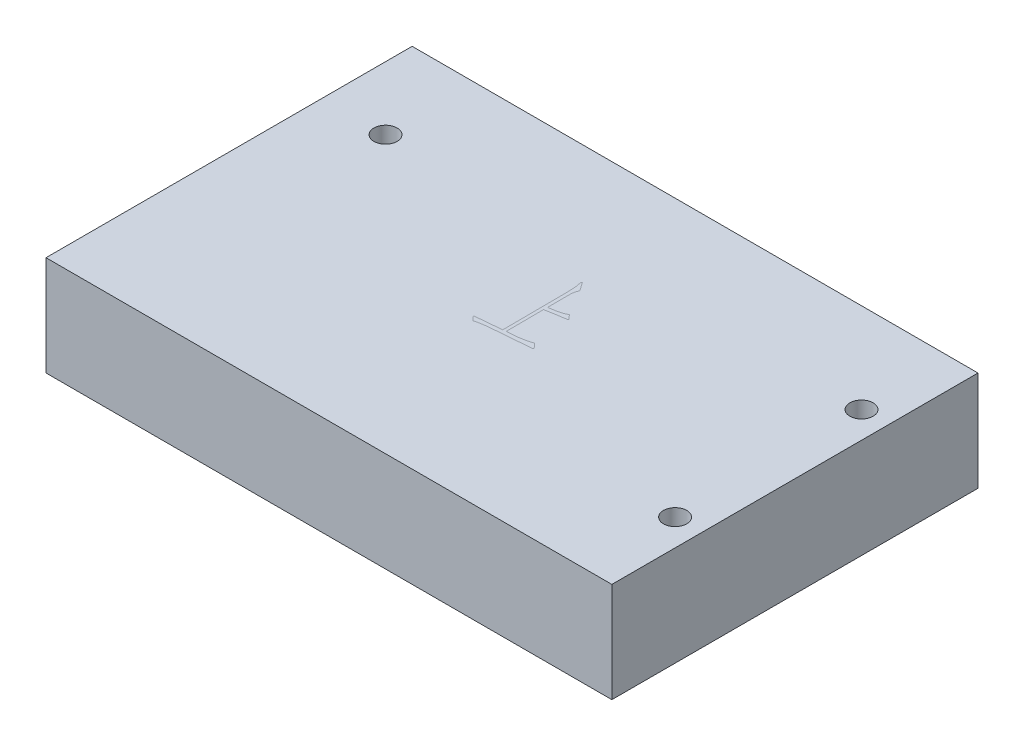
ISO-10303-21;
HEADER;
FILE_DESCRIPTION(('STEP AP214'),'2;1');
FILE_NAME('part.step','',(''),(''),'','','');
FILE_SCHEMA(('AUTOMOTIVE_DESIGN { 1 0 10303 214 1 1 1 1 }'));
ENDSEC;
DATA;
#1=APPLICATION_CONTEXT('core data for automotive mechanical design processes');
#2=APPLICATION_PROTOCOL_DEFINITION('international standard','automotive_design',2000,#1);
#3=PRODUCT_CONTEXT('',#1,'mechanical');
#4=PRODUCT('Part','Part','',(#3));
#5=PRODUCT_RELATED_PRODUCT_CATEGORY('part','',(#4));
#6=PRODUCT_DEFINITION_FORMATION('','',#4);
#7=PRODUCT_DEFINITION_CONTEXT('part definition',#1,'design');
#8=PRODUCT_DEFINITION('design','',#6,#7);
#9=PRODUCT_DEFINITION_SHAPE('','',#8);
#10=(LENGTH_UNIT() NAMED_UNIT(*) SI_UNIT(.MILLI.,.METRE.));
#11=(NAMED_UNIT(*) PLANE_ANGLE_UNIT() SI_UNIT($,.RADIAN.));
#12=(NAMED_UNIT(*) SI_UNIT($,.STERADIAN.) SOLID_ANGLE_UNIT());
#13=UNCERTAINTY_MEASURE_WITH_UNIT(LENGTH_MEASURE(1.E-05),#10,'distance_accuracy_value','');
#14=(GEOMETRIC_REPRESENTATION_CONTEXT(3) GLOBAL_UNCERTAINTY_ASSIGNED_CONTEXT((#13)) GLOBAL_UNIT_ASSIGNED_CONTEXT((#10,
#11,#12)) REPRESENTATION_CONTEXT('',''));
#15=CARTESIAN_POINT('',(0.,0.,0.));
#16=DIRECTION('',(0.,0.,1.));
#17=DIRECTION('',(1.,0.,0.));
#18=AXIS2_PLACEMENT_3D('',#15,#16,#17);
#19=CARTESIAN_POINT('',(0.,15.,0.));
#20=DIRECTION('',(0.,-1.,0.));
#21=DIRECTION('',(0.,0.,-1.));
#22=AXIS2_PLACEMENT_3D('',#19,#20,#21);
#23=PLANE('',#22);
#24=CARTESIAN_POINT('',(43.6304159329871,15.,-34.4012403551576));
#25=CARTESIAN_POINT('',(43.6285832728739,15.,-34.454265991002));
#26=CARTESIAN_POINT('',(43.6267491316268,15.,-34.5072915864593));
#27=CARTESIAN_POINT('',(43.6231058574937,15.,-34.6133444274817));
#28=CARTESIAN_POINT('',(43.6212967249818,15.,-34.6663716730596));
#29=CARTESIAN_POINT('',(43.6177301226751,15.,-34.7724687952729));
#30=CARTESIAN_POINT('',(43.6159726937362,15.,-34.8255386732924));
#31=CARTESIAN_POINT('',(43.6125200089942,15.,-34.9316796062416));
#32=CARTESIAN_POINT('',(43.6108247522266,15.,-34.9847506611404));
#33=CARTESIAN_POINT('',(43.6074169088284,15.,-35.0908928143295));
#34=CARTESIAN_POINT('',(43.6057043220144,15.,-35.1439639126143));
#35=CARTESIAN_POINT('',(43.6022278782611,15.,-35.250104658213));
#36=CARTESIAN_POINT('',(43.6004640209766,15.,-35.3031743055147));
#37=CARTESIAN_POINT('',(43.5967029564214,15.,-35.409272758926));
#38=CARTESIAN_POINT('',(43.5947058970461,15.,-35.4623015696818));
#39=CARTESIAN_POINT('',(43.591188950543,15.,-35.5418185556303));
#40=CARTESIAN_POINT('',(43.5899298459645,15.,-35.5683180363251));
#41=CARTESIAN_POINT('',(43.5872438016238,15.,-35.6213096957998));
#42=CARTESIAN_POINT('',(43.5858168536847,15.,-35.6478018741608));
#43=CARTESIAN_POINT('',(43.5823475773483,15.,-35.7095081415847));
#44=CARTESIAN_POINT('',(43.580257417322,15.,-35.7447195115175));
#45=CARTESIAN_POINT('',(43.5756568296041,15.,-35.8151136980117));
#46=CARTESIAN_POINT('',(43.573146440726,15.,-35.8502965169089));
#47=CARTESIAN_POINT('',(43.567214957844,15.,-35.9205862301696));
#48=CARTESIAN_POINT('',(43.5637938948243,15.,-35.9556931270752));
#49=CARTESIAN_POINT('',(43.5560561340244,15.,-36.0258092508598));
#50=CARTESIAN_POINT('',(43.55173937888,15.,-36.0608184713376));
#51=CARTESIAN_POINT('',(43.5423813749196,15.,-36.130757469123));
#52=CARTESIAN_POINT('',(43.5373397277801,15.,-36.1656871919566));
#53=CARTESIAN_POINT('',(43.5269633465459,15.,-36.235502410041));
#54=CARTESIAN_POINT('',(43.5216286089425,15.,-36.2703879047571));
#55=CARTESIAN_POINT('',(43.5106388816591,15.,-36.3402877146074));
#56=CARTESIAN_POINT('',(43.5049824244971,15.,-36.3753018020442));
#57=CARTESIAN_POINT('',(43.4932361218893,15.,-36.4452560529697));
#58=CARTESIAN_POINT('',(43.4871462916571,15.,-36.4801962190093));
#59=CARTESIAN_POINT('',(43.4746127119021,15.,-36.5500043746615));
#60=CARTESIAN_POINT('',(43.4681690432113,15.,-36.5848723788861));
#61=CARTESIAN_POINT('',(43.4550305554074,15.,-36.6545621690969));
#62=CARTESIAN_POINT('',(43.4483357269324,15.,-36.68938395331));
#63=CARTESIAN_POINT('',(43.4347891314852,15.,-36.7589591534118));
#64=CARTESIAN_POINT('',(43.4279375353422,15.,-36.7937126027313));
#65=CARTESIAN_POINT('',(43.414152703554,15.,-36.8632008299132));
#66=CARTESIAN_POINT('',(43.4072194736149,15.,-36.8979356089052));
#67=CARTESIAN_POINT('',(43.4002859521646,15.,-36.9326701442051));
#68=B_SPLINE_CURVE_WITH_KNOTS('',3,(#24,#25,#26,#27,#28,#29,#30,#31,#32,#33,#34,#35,#36,#37,#38,
#39,#40,#41,#42,#43,#44,#45,#46,#47,#48,#49,#50,#51,#52,#53,#54,#55,#56,#57,#58,#59,#60,#61,#62,
#63,#64,#65,#66,#67),.UNSPECIFIED.,.F.,.F.,(4,2,2,2,2,2,2,2,2,2,2,2,2,2,2,2,2,2,2,2,2,4),(0.,
0.159171907330281,0.318346192832109,0.477643051066184,0.63693743701451,0.796233511283576,
0.955530658156853,1.11472732278019,1.19431478075348,1.27390611771138,1.37972577234889,
1.48553565856637,1.59134194523655,1.69715501031225,1.80302644279269,1.9088991429829,
2.01530104405257,2.12169921172574,2.22807317378165,2.3344511048819,2.44071817130337,
2.54697785331188),.UNSPECIFIED.);
#69=CARTESIAN_POINT('',(43.6304159329871,15.,-34.4012403551575));
#70=VERTEX_POINT('',#69);
#71=CARTESIAN_POINT('',(43.4002859521646,15.,-36.9326701442051));
#72=VERTEX_POINT('',#71);
#73=EDGE_CURVE('E11',#70,#72,#68,.T.);
#74=ORIENTED_EDGE('',*,*,#73,.F.);
#75=DIRECTION('',(-0.00607003205575866,0.,-0.999981577185721));
#76=VECTOR('',#75,1.);
#77=CARTESIAN_POINT('',(43.8376211424196,15.,-0.266100667905875));
#78=LINE('',#77,#76);
#79=CARTESIAN_POINT('',(43.6879484281927,15.,-24.9232944783197));
#80=VERTEX_POINT('',#79);
#81=EDGE_CURVE('E172',#80,#70,#78,.T.);
#82=ORIENTED_EDGE('',*,*,#81,.F.);
#83=DIRECTION('',(0.995730377013171,0.,-0.0923093510604914));
#84=VECTOR('',#83,1.);
#85=CARTESIAN_POINT('',(-1.91856449768023,15.,-20.6953350733376));
#86=LINE('',#85,#84);
#87=CARTESIAN_POINT('',(40.8837719952074,15.,-24.6633328333165));
#88=VERTEX_POINT('',#87);
#89=EDGE_CURVE('E175',#88,#80,#86,.T.);
#90=ORIENTED_EDGE('',*,*,#89,.F.);
#91=DIRECTION('',(0.996815278536125,0.,-0.0797452222828909));
#92=VECTOR('',#91,1.);
#93=CARTESIAN_POINT('',(-1.7005271123768,15.,-21.2565889047097));
#94=LINE('',#93,#92);
#95=CARTESIAN_POINT('',(39.8183554173254,15.,-24.578099507086));
#96=VERTEX_POINT('',#95);
#97=EDGE_CURVE('E183',#96,#88,#94,.T.);
#98=ORIENTED_EDGE('',*,*,#97,.F.);
#99=CARTESIAN_POINT('',(39.7608229221198,15.,-24.3756703572884));
#100=CARTESIAN_POINT('',(39.748901573268,15.,-24.3920615223878));
#101=CARTESIAN_POINT('',(39.7241693136792,15.,-24.4260669487235));
#102=CARTESIAN_POINT('',(39.7115870829383,15.,-24.489907431768));
#103=CARTESIAN_POINT('',(39.7403496147427,15.,-24.5618128840292));
#104=CARTESIAN_POINT('',(39.7903341662888,15.,-24.5722490249666));
#105=CARTESIAN_POINT('',(39.8183554173254,15.,-24.578099507086));
#106=B_SPLINE_CURVE_WITH_KNOTS('',3,(#99,#100,#101,#102,#103,#104,#105),.UNSPECIFIED.,.F.,.F.,
(4,1,1,1,4),(0.,0.224692634421683,0.466151660461418,0.700725566700259,1.),.UNSPECIFIED.);
#107=CARTESIAN_POINT('',(39.7608229221198,15.,-24.3756703572884));
#108=VERTEX_POINT('',#107);
#109=EDGE_CURVE('E186',#108,#96,#106,.T.);
#110=ORIENTED_EDGE('',*,*,#109,.F.);
#111=DIRECTION('',(-0.707106781186548,0.,-0.707106781186548));
#112=VECTOR('',#111,1.);
#113=CARTESIAN_POINT('',(32.0682466397041,15.,-32.0682466397041));
#114=LINE('',#113,#112);
#115=CARTESIAN_POINT('',(40.2786153789704,15.,-23.8578779004378));
#116=VERTEX_POINT('',#115);
#117=EDGE_CURVE('E191',#116,#108,#114,.T.);
#118=ORIENTED_EDGE('',*,*,#117,.F.);
#119=CARTESIAN_POINT('',(45.9466315733024,15.,-24.5333520108149));
#120=CARTESIAN_POINT('',(45.7989234739823,15.,-24.5209043032944));
#121=CARTESIAN_POINT('',(45.5106743377525,15.,-24.4966128733907));
#122=CARTESIAN_POINT('',(45.0890925540405,15.,-24.4673519953322));
#123=CARTESIAN_POINT('',(44.6910188013324,15.,-24.4305673951137));
#124=CARTESIAN_POINT('',(44.3150091412477,15.,-24.4026346818154));
#125=CARTESIAN_POINT('',(43.9614526526095,15.,-24.3715558889798));
#126=CARTESIAN_POINT('',(43.6295932885963,15.,-24.3450111077905));
#127=CARTESIAN_POINT('',(43.32074403826,15.,-24.3166068168085));
#128=CARTESIAN_POINT('',(43.0352184347987,15.,-24.2909856071705));
#129=CARTESIAN_POINT('',(42.7722876565145,15.,-24.2682070056812));
#130=CARTESIAN_POINT('',(42.5316256712335,15.,-24.2441632726846));
#131=CARTESIAN_POINT('',(42.3128621127058,15.,-24.2228595011967));
#132=CARTESIAN_POINT('',(42.1166625830201,15.,-24.2045287610733));
#133=CARTESIAN_POINT('',(41.9434986501802,15.,-24.1846535359173));
#134=CARTESIAN_POINT('',(41.7929214462582,15.,-24.1676467997352));
#135=CARTESIAN_POINT('',(41.6641654961637,15.,-24.1534986614887));
#136=CARTESIAN_POINT('',(41.4652038105082,15.,-24.1246907982284));
#137=CARTESIAN_POINT('',(41.1970988909247,15.,-24.0840005785148));
#138=CARTESIAN_POINT('',(40.8642580798744,15.,-24.0163387885662));
#139=CARTESIAN_POINT('',(40.5592117352288,15.,-23.9476982122806));
#140=CARTESIAN_POINT('',(40.3691748971667,15.,-23.8868664599229));
#141=CARTESIAN_POINT('',(40.2786153789704,15.,-23.8578779004378));
#142=B_SPLINE_CURVE_WITH_KNOTS('',3,(#119,#120,#121,#122,#123,#124,#125,#126,#127,#128,#129,
#130,#131,#132,#133,#134,#135,#136,#137,#138,#139,#140,#141),.UNSPECIFIED.,.F.,.F.,(4,1,1,1,1,1,
1,1,1,1,1,1,1,1,1,1,1,1,1,1,4),(0.,0.0777687064644551,0.151763935540928,0.221703244772091,
0.287496014786442,0.34957476730516,0.40790895989643,0.462159279704267,0.512293599289809,
0.558311919269334,0.600619899854703,0.639182854090695,0.673629891067738,0.703999924733564,
0.730625175752077,0.753135552795725,0.771949536150035,0.836093284444404,0.895362659511708,
0.950136472293573,1.),.UNSPECIFIED.);
#143=CARTESIAN_POINT('',(45.9466315733024,15.,-24.5333520108149));
#144=VERTEX_POINT('',#143);
#145=EDGE_CURVE('E197',#144,#116,#142,.T.);
#146=ORIENTED_EDGE('',*,*,#145,.F.);
#147=DIRECTION('',(-0.997007488789346,0.,0.07730502763703));
#148=VECTOR('',#147,1.);
#149=CARTESIAN_POINT('',(-1.61629584133697,15.,-20.8454625419489));
#150=LINE('',#149,#148);
#151=CARTESIAN_POINT('',(47.8153722509074,15.,-24.6782486654069));
#152=VERTEX_POINT('',#151);
#153=EDGE_CURVE('E202',#152,#144,#150,.T.);
#154=ORIENTED_EDGE('',*,*,#153,.F.);
#155=DIRECTION('',(-0.996428304896931,0.,0.0844430766861855));
#156=VECTOR('',#155,1.);
#157=CARTESIAN_POINT('',(-1.73551028237952,15.,-20.4790213320772));
#158=LINE('',#157,#156);
#159=CARTESIAN_POINT('',(48.3182488756676,15.,-24.7208653285221));
#160=VERTEX_POINT('',#159);
#161=EDGE_CURVE('E208',#160,#152,#158,.T.);
#162=ORIENTED_EDGE('',*,*,#161,.F.);
#163=CARTESIAN_POINT('',(48.3757813708733,15.,-24.965911141435));
#164=CARTESIAN_POINT('',(48.3961522408188,15.,-24.9357607726857));
#165=CARTESIAN_POINT('',(48.4316116113826,15.,-24.883278325889));
#166=CARTESIAN_POINT('',(48.4529349168912,15.,-24.8098739722251));
#167=CARTESIAN_POINT('',(48.4433159006632,15.,-24.7597123646048));
#168=CARTESIAN_POINT('',(48.4137218629214,15.,-24.7360453760989));
#169=CARTESIAN_POINT('',(48.3714471929941,15.,-24.7216230071347));
#170=CARTESIAN_POINT('',(48.3376085456291,15.,-24.7211410591958));
#171=CARTESIAN_POINT('',(48.3182488756676,15.,-24.7208653285221));
#172=B_SPLINE_CURVE_WITH_KNOTS('',3,(#163,#164,#165,#166,#167,#168,#169,#170,#171),
.UNSPECIFIED.,.F.,.F.,(4,1,1,1,1,1,4),(0.,0.306630329437179,0.533748362572841,0.62688853650092,
0.716080281366152,0.837564664183912,1.),.UNSPECIFIED.);
#173=CARTESIAN_POINT('',(48.3757813708733,15.,-24.965911141435));
#174=VERTEX_POINT('',#173);
#175=EDGE_CURVE('E211',#174,#160,#172,.T.);
#176=ORIENTED_EDGE('',*,*,#175,.F.);
#177=DIRECTION('',(0.68940564383784,0.,0.724375495336869));
#178=VECTOR('',#177,1.);
#179=CARTESIAN_POINT('',(37.8514234261582,15.,-36.0241133297226));
#180=LINE('',#179,#178);
#181=CARTESIAN_POINT('',(47.7876714198825,15.,-25.5838527566065));
#182=VERTEX_POINT('',#181);
#183=EDGE_CURVE('E216',#182,#174,#180,.T.);
#184=ORIENTED_EDGE('',*,*,#183,.F.);
#185=CARTESIAN_POINT('',(44.1482083898377,15.,-24.965911141435));
#186=CARTESIAN_POINT('',(44.3521337590722,15.,-24.978360251411));
#187=CARTESIAN_POINT('',(44.7447102713893,15.,-25.0023260198399));
#188=CARTESIAN_POINT('',(45.3109857616784,15.,-25.0537835941935));
#189=CARTESIAN_POINT('',(45.8326467827162,15.,-25.1147451209188));
#190=CARTESIAN_POINT('',(46.310420827893,15.,-25.1862771523202));
#191=CARTESIAN_POINT('',(46.7432060287902,15.,-25.2694026399312));
#192=CARTESIAN_POINT('',(47.1328667835992,15.,-25.3595741839896));
#193=CARTESIAN_POINT('',(47.4779037328531,15.,-25.4616860185862));
#194=CARTESIAN_POINT('',(47.6887234205469,15.,-25.5448294665133));
#195=CARTESIAN_POINT('',(47.7876714198824,15.,-25.5838527566065));
#196=B_SPLINE_CURVE_WITH_KNOTS('',3,(#185,#186,#187,#188,#189,#190,#191,#192,#193,#194,#195),
.UNSPECIFIED.,.F.,.F.,(4,1,1,1,1,1,1,1,4),(0.,0.165336213949227,0.318288570350859,
0.460104121495084,0.590339977561362,0.709163636832215,0.816662264541468,0.913950626126181,1.),.UNSPECIFIED.);
#197=CARTESIAN_POINT('',(44.1482083898377,15.,-24.965911141435));
#198=VERTEX_POINT('',#197);
#199=EDGE_CURVE('E222',#198,#182,#196,.T.);
#200=ORIENTED_EDGE('',*,*,#199,.F.);
#201=DIRECTION('',(0.005276971380947,0.,0.999986076689593));
#202=VECTOR('',#201,1.);
#203=CARTESIAN_POINT('',(44.278721584252,15.,-0.233660799916865));
#204=LINE('',#203,#202);
#205=CARTESIAN_POINT('',(44.118376725657,15.,-30.6190115036766));
#206=VERTEX_POINT('',#205);
#207=EDGE_CURVE('E227',#206,#198,#204,.T.);
#208=ORIENTED_EDGE('',*,*,#207,.F.);
#209=DIRECTION('',(-0.984234677595054,0.,0.176867462862337));
#210=VECTOR('',#209,1.);
#211=CARTESIAN_POINT('',(-3.95001422110567,15.,-21.9810976563384));
#212=LINE('',#211,#210);
#213=CARTESIAN_POINT('',(45.3990074522711,15.,-30.8491414844991));
#214=VERTEX_POINT('',#213);
#215=EDGE_CURVE('E233',#214,#206,#212,.T.);
#216=ORIENTED_EDGE('',*,*,#215,.F.);
#217=DIRECTION('',(-0.98848801526015,0.,0.151299186009211));
#218=VECTOR('',#217,1.);
#219=CARTESIAN_POINT('',(-3.5744695600217,15.,-23.3532011254745));
#220=LINE('',#219,#218);
#221=CARTESIAN_POINT('',(46.2342940493306,15.,-30.976991473845));
#222=VERTEX_POINT('',#221);
#223=EDGE_CURVE('E236',#222,#214,#220,.T.);
#224=ORIENTED_EDGE('',*,*,#223,.F.);
#225=DIRECTION('',(-0.987440631916706,0.,0.157990501106672));
#226=VECTOR('',#225,1.);
#227=CARTESIAN_POINT('',(-3.6785498324418,15.,-22.9909364527614));
#228=LINE('',#227,#226);
#229=CARTESIAN_POINT('',(47.1398981405302,15.,-31.1218881284369));
#230=VERTEX_POINT('',#229);
#231=EDGE_CURVE('E239',#230,#222,#228,.T.);
#232=ORIENTED_EDGE('',*,*,#231,.F.);
#233=CARTESIAN_POINT('',(47.2251314667608,15.,-31.3669339413497));
#234=CARTESIAN_POINT('',(47.2384555144193,15.,-31.3425597508229));
#235=CARTESIAN_POINT('',(47.2643379641105,15.,-31.2952119946275));
#236=CARTESIAN_POINT('',(47.2787588180918,15.,-31.2302988376479));
#237=CARTESIAN_POINT('',(47.2741712805605,15.,-31.1781596990134));
#238=CARTESIAN_POINT('',(47.2434293159228,15.,-31.1487139355597));
#239=CARTESIAN_POINT('',(47.1982050937125,15.,-31.1285809230862));
#240=CARTESIAN_POINT('',(47.1607937930186,15.,-31.1242866470275));
#241=CARTESIAN_POINT('',(47.1398981405302,15.,-31.1218881284369));
#242=B_SPLINE_CURVE_WITH_KNOTS('',3,(#233,#234,#235,#236,#237,#238,#239,#240,#241),
.UNSPECIFIED.,.F.,.F.,(4,1,1,1,1,1,4),(0.,0.240463439428795,0.467109022202763,0.573791783748756,
0.674394348810988,0.818136701763056,1.),.UNSPECIFIED.);
#243=CARTESIAN_POINT('',(47.2251314667608,15.,-31.3669339413497));
#244=VERTEX_POINT('',#243);
#245=EDGE_CURVE('E242',#244,#230,#242,.T.);
#246=ORIENTED_EDGE('',*,*,#245,.F.);
#247=DIRECTION('',(0.698431593965948,0.,0.715676818508316));
#248=VECTOR('',#247,1.);
#249=CARTESIAN_POINT('',(39.8671990752572,15.,-38.9065436758534));
#250=LINE('',#249,#248);
#251=CARTESIAN_POINT('',(46.7073390099101,15.,-31.897511397135));
#252=VERTEX_POINT('',#251);
#253=EDGE_CURVE('E247',#252,#244,#250,.T.);
#254=ORIENTED_EDGE('',*,*,#253,.F.);
#255=CARTESIAN_POINT('',(44.1332925577473,15.,-31.1943364557329));
#256=CARTESIAN_POINT('',(44.2320399778488,15.,-31.2105585998778));
#257=CARTESIAN_POINT('',(44.4218158795591,15.,-31.2417348273643));
#258=CARTESIAN_POINT('',(44.6939164692239,15.,-31.2883014252905));
#259=CARTESIAN_POINT('',(44.9417597965972,15.,-31.3333245331221));
#260=CARTESIAN_POINT('',(45.1649481808547,15.,-31.375206493182));
#261=CARTESIAN_POINT('',(45.3627962413193,15.,-31.4165785552385));
#262=CARTESIAN_POINT('',(45.5367024286971,15.,-31.451544390833));
#263=CARTESIAN_POINT('',(45.6850901784033,15.,-31.4877225531246));
#264=CARTESIAN_POINT('',(45.9274064839186,15.,-31.5545197183475));
#265=CARTESIAN_POINT('',(46.2733892952414,15.,-31.6749856139089));
#266=CARTESIAN_POINT('',(46.5604936868568,15.,-31.8222103439923));
#267=CARTESIAN_POINT('',(46.7073390099101,15.,-31.897511397135));
#268=B_SPLINE_CURVE_WITH_KNOTS('',3,(#255,#256,#257,#258,#259,#260,#261,#262,#263,#264,#265,
#266,#267),.UNSPECIFIED.,.F.,.F.,(4,1,1,1,1,1,1,1,1,1,4),(0.,0.111882670722389,
0.215019640009733,0.308634134817035,0.393515171197862,0.468893232733022,0.534617818096033,
0.591821555528924,0.6396005333735,0.815666434751392,1.),.UNSPECIFIED.);
#269=CARTESIAN_POINT('',(44.1332925577473,15.,-31.1943364557329));
#270=VERTEX_POINT('',#269);
#271=EDGE_CURVE('E253',#270,#252,#268,.T.);
#272=ORIENTED_EDGE('',*,*,#271,.F.);
#273=DIRECTION('',(0.0051621731056553,0.,0.999986675895648));
#274=VECTOR('',#273,1.);
#275=CARTESIAN_POINT('',(44.293144911504,15.,-0.228651928009208));
#276=LINE('',#275,#274);
#277=CARTESIAN_POINT('',(44.118376725657,15.,-34.0837462149487));
#278=VERTEX_POINT('',#277);
#279=EDGE_CURVE('E258',#278,#270,#276,.T.);
#280=ORIENTED_EDGE('',*,*,#279,.F.);
#281=CARTESIAN_POINT('',(44.3932542027505,15.,-35.8097210711175));
#282=CARTESIAN_POINT('',(44.3865773370288,15.,-35.7925141899272));
#283=CARTESIAN_POINT('',(44.3798991355433,15.,-35.7753079192716));
#284=CARTESIAN_POINT('',(44.3665480475525,15.,-35.7408945348499));
#285=CARTESIAN_POINT('',(44.3598751607453,15.,-35.7236874212009));
#286=CARTESIAN_POINT('',(44.3465417566697,15.,-35.6892678899998));
#287=CARTESIAN_POINT('',(44.3398812396037,15.,-35.6720554723661));
#288=CARTESIAN_POINT('',(44.3265637960313,15.,-35.6376287398742));
#289=CARTESIAN_POINT('',(44.3199068697831,15.,-35.6204144249652));
#290=CARTESIAN_POINT('',(44.3001280480527,15.,-35.5687844202713));
#291=CARTESIAN_POINT('',(44.2871666301974,15.,-35.5343024992451));
#292=CARTESIAN_POINT('',(44.2690028713287,15.,-35.4821258075076));
#293=CARTESIAN_POINT('',(44.2631607207397,15.,-35.4646558138346));
#294=CARTESIAN_POINT('',(44.2518144230123,15.,-35.4296055766873));
#295=CARTESIAN_POINT('',(44.2463103154199,15.,-35.412025320578));
#296=CARTESIAN_POINT('',(44.2367477927008,15.,-35.3809141484112));
#297=CARTESIAN_POINT('',(44.2326515101328,15.,-35.3673947665751));
#298=CARTESIAN_POINT('',(44.2245126771684,15.,-35.3403397895386));
#299=CARTESIAN_POINT('',(44.2204701266743,15.,-35.3268041943678));
#300=CARTESIAN_POINT('',(44.2125625333513,15.,-35.2996818579289));
#301=CARTESIAN_POINT('',(44.2086974747907,15.,-35.2860951213096));
#302=CARTESIAN_POINT('',(44.2012784738465,15.,-35.2588376173188));
#303=CARTESIAN_POINT('',(44.1977245002964,15.,-35.2451668585124));
#304=CARTESIAN_POINT('',(44.1876517822669,15.,-35.2040220626567));
#305=CARTESIAN_POINT('',(44.1817185635644,15.,-35.1764034933408));
#306=CARTESIAN_POINT('',(44.1710779897924,15.,-35.1209028673955));
#307=CARTESIAN_POINT('',(44.1663721980856,15.,-35.0930205211591));
#308=CARTESIAN_POINT('',(44.1578786304836,15.,-35.037097248308));
#309=CARTESIAN_POINT('',(44.1540915427901,15.,-35.0090562188154));
#310=CARTESIAN_POINT('',(44.1472624472577,15.,-34.952877981932));
#311=CARTESIAN_POINT('',(44.144220617542,15.,-34.924740753175));
#312=CARTESIAN_POINT('',(44.1372220941132,15.,-34.8514950571563));
#313=CARTESIAN_POINT('',(44.1338116760044,15.,-34.8063340798668));
#314=CARTESIAN_POINT('',(44.1283923721589,15.,-34.715945660636));
#315=CARTESIAN_POINT('',(44.1263831563481,15.,-34.6707182368644));
#316=CARTESIAN_POINT('',(44.1239283801625,15.,-34.6028575002665));
#317=CARTESIAN_POINT('',(44.1232032745421,15.,-34.5802328966333));
#318=CARTESIAN_POINT('',(44.1218690839214,15.,-34.5349802366414));
#319=CARTESIAN_POINT('',(44.1212599990494,15.,-34.512352180279));
#320=CARTESIAN_POINT('',(44.1196519345141,15.,-34.4446084067047));
#321=CARTESIAN_POINT('',(44.1188668108969,15.,-34.399486704121));
#322=CARTESIAN_POINT('',(44.1183623078111,15.,-34.3318041776347));
#323=CARTESIAN_POINT('',(44.1183063082361,15.,-34.3092456675643));
#324=CARTESIAN_POINT('',(44.1183059892417,15.,-34.2641283491849));
#325=CARTESIAN_POINT('',(44.1183616724948,15.,-34.2415695408816));
#326=CARTESIAN_POINT('',(44.1184034125421,15.,-34.1964663152965));
#327=CARTESIAN_POINT('',(44.1183895139829,15.,-34.1739218980672));
#328=CARTESIAN_POINT('',(44.1183637287783,15.,-34.1288337119494));
#329=CARTESIAN_POINT('',(44.1183518420751,15.,-34.106289943061));
#330=CARTESIAN_POINT('',(44.118376725657,15.,-34.0837462149487));
#331=B_SPLINE_CURVE_WITH_KNOTS('',3,(#281,#282,#283,#284,#285,#286,#287,#288,#289,#290,#291,
#292,#293,#294,#295,#296,#297,#298,#299,#300,#301,#302,#303,#304,#305,#306,#307,#308,#309,#310,
#311,#312,#313,#314,#315,#316,#317,#318,#319,#320,#321,#322,#323,#324,#325,#326,#327,#328,#329,
#330),.UNSPECIFIED.,.F.,.F.,(4,2,2,2,2,2,2,2,2,2,2,2,2,2,2,2,2,2,2,2,2,2,2,2,4),(0.,
0.0553705389687148,0.110737669960339,0.166105699405278,0.221477288732297,0.331964816787578,
0.387221871707687,0.44248537861677,0.484864277821327,0.527243100012757,0.569618158757411,
0.611988967217668,0.696692953676146,0.781504305757566,0.866378995226625,0.951273950755734,
1.08711007876135,1.2229141977194,1.29082280569715,1.35873148871591,1.49410943653167,
1.56178444681699,1.62946107656713,1.69709428769228,1.76472555353863),.UNSPECIFIED.);
#332=CARTESIAN_POINT('',(44.3932542027505,15.,-35.8097210711175));
#333=VERTEX_POINT('',#332);
#334=EDGE_CURVE('E264',#333,#278,#331,.T.);
#335=ORIENTED_EDGE('',*,*,#334,.F.);
#336=DIRECTION('',(0.576413111940898,0.,0.817158445090431));
#337=VECTOR('',#336,1.);
#338=CARTESIAN_POINT('',(46.5106283313262,15.,-32.8080021394374));
#339=LINE('',#338,#337);
#340=CARTESIAN_POINT('',(43.5004351104854,15.,-37.0754359656412));
#341=VERTEX_POINT('',#340);
#342=EDGE_CURVE('E271',#341,#333,#339,.T.);
#343=ORIENTED_EDGE('',*,*,#342,.F.);
#344=DIRECTION('',(0.574282108619682,0.,-0.818657473989783));
#345=VECTOR('',#344,1.);
#346=CARTESIAN_POINT('',(11.723336123495,15.,8.22383280304853));
#347=LINE('',#346,#345);
#348=EDGE_CURVE('E48',#72,#341,#347,.T.);
#349=ORIENTED_EDGE('',*,*,#348,.F.);
#350=EDGE_LOOP('',(#74,#82,#90,#98,#110,#118,#146,#154,#162,#176,#184,#200,#208,#216,#224,#232,
#246,#254,#272,#280,#335,#343,#349));
#351=FACE_BOUND('',#350,.T.);
#352=ADVANCED_FACE('F36',(#351),#23,.F.);
#353=ORIENTED_EDGE('',*,*,#81,.T.);
#354=ORIENTED_EDGE('',*,*,#73,.T.);
#355=ORIENTED_EDGE('',*,*,#348,.T.);
#356=ORIENTED_EDGE('',*,*,#342,.T.);
#357=ORIENTED_EDGE('',*,*,#334,.T.);
#358=ORIENTED_EDGE('',*,*,#279,.T.);
#359=ORIENTED_EDGE('',*,*,#271,.T.);
#360=ORIENTED_EDGE('',*,*,#253,.T.);
#361=ORIENTED_EDGE('',*,*,#245,.T.);
#362=ORIENTED_EDGE('',*,*,#231,.T.);
#363=ORIENTED_EDGE('',*,*,#223,.T.);
#364=ORIENTED_EDGE('',*,*,#215,.T.);
#365=ORIENTED_EDGE('',*,*,#207,.T.);
#366=ORIENTED_EDGE('',*,*,#199,.T.);
#367=ORIENTED_EDGE('',*,*,#183,.T.);
#368=ORIENTED_EDGE('',*,*,#175,.T.);
#369=ORIENTED_EDGE('',*,*,#161,.T.);
#370=ORIENTED_EDGE('',*,*,#153,.T.);
#371=ORIENTED_EDGE('',*,*,#145,.T.);
#372=ORIENTED_EDGE('',*,*,#117,.T.);
#373=ORIENTED_EDGE('',*,*,#109,.T.);
#374=ORIENTED_EDGE('',*,*,#97,.T.);
#375=ORIENTED_EDGE('',*,*,#89,.T.);
#376=EDGE_LOOP('',(#353,#354,#355,#356,#357,#358,#359,#360,#361,#362,#363,#364,#365,#366,#367,
#368,#369,#370,#371,#372,#373,#374,#375));
#377=FACE_BOUND('',#376,.T.);
#378=DIRECTION('',(0.,0.,1.));
#379=VECTOR('',#378,1.);
#380=CARTESIAN_POINT('',(0.,15.,0.));
#381=LINE('',#380,#379);
#382=CARTESIAN_POINT('',(0.,15.,-55.));
#383=VERTEX_POINT('',#382);
#384=CARTESIAN_POINT('',(0.,15.,0.));
#385=VERTEX_POINT('',#384);
#386=EDGE_CURVE('E157',#383,#385,#381,.T.);
#387=ORIENTED_EDGE('',*,*,#386,.T.);
#388=DIRECTION('',(1.,0.,0.));
#389=VECTOR('',#388,1.);
#390=CARTESIAN_POINT('',(0.,15.,0.));
#391=LINE('',#390,#389);
#392=CARTESIAN_POINT('',(85.,15.,0.));
#393=VERTEX_POINT('',#392);
#394=EDGE_CURVE('E146',#385,#393,#391,.T.);
#395=ORIENTED_EDGE('',*,*,#394,.T.);
#396=DIRECTION('',(0.,0.,-1.));
#397=VECTOR('',#396,1.);
#398=CARTESIAN_POINT('',(85.,15.,0.));
#399=LINE('',#398,#397);
#400=CARTESIAN_POINT('',(85.,15.,-55.));
#401=VERTEX_POINT('',#400);
#402=EDGE_CURVE('E156',#393,#401,#399,.T.);
#403=ORIENTED_EDGE('',*,*,#402,.T.);
#404=DIRECTION('',(-1.,0.,0.));
#405=VECTOR('',#404,1.);
#406=CARTESIAN_POINT('',(0.,15.,-55.));
#407=LINE('',#406,#405);
#408=EDGE_CURVE('E163',#401,#383,#407,.T.);
#409=ORIENTED_EDGE('',*,*,#408,.T.);
#410=EDGE_LOOP('',(#387,#395,#403,#409));
#411=FACE_BOUND('',#410,.T.);
#412=CARTESIAN_POINT('',(81.,15.,-41.5));
#413=DIRECTION('',(0.,1.,0.));
#414=DIRECTION('',(0.,0.,1.));
#415=AXIS2_PLACEMENT_3D('',#412,#413,#414);
#416=CIRCLE('',#415,1.75);
#417=CARTESIAN_POINT('',(81.,15.,-39.75));
#418=VERTEX_POINT('',#417);
#419=EDGE_CURVE('E456',#418,#418,#416,.T.);
#420=ORIENTED_EDGE('',*,*,#419,.F.);
#421=EDGE_LOOP('',(#420));
#422=FACE_BOUND('',#421,.T.);
#423=CARTESIAN_POINT('',(81.,15.,-13.5));
#424=DIRECTION('',(0.,1.,0.));
#425=DIRECTION('',(0.,0.,1.));
#426=AXIS2_PLACEMENT_3D('',#423,#424,#425);
#427=CIRCLE('',#426,1.75);
#428=CARTESIAN_POINT('',(81.,15.,-11.75));
#429=VERTEX_POINT('',#428);
#430=EDGE_CURVE('E450',#429,#429,#427,.T.);
#431=ORIENTED_EDGE('',*,*,#430,.F.);
#432=EDGE_LOOP('',(#431));
#433=FACE_BOUND('',#432,.T.);
#434=CARTESIAN_POINT('',(9.5,15.,-41.5));
#435=DIRECTION('',(0.,1.,0.));
#436=DIRECTION('',(0.,0.,1.));
#437=AXIS2_PLACEMENT_3D('',#434,#435,#436);
#438=CIRCLE('',#437,1.75);
#439=CARTESIAN_POINT('',(9.5,15.,-39.75));
#440=VERTEX_POINT('',#439);
#441=EDGE_CURVE('E441',#440,#440,#438,.T.);
#442=ORIENTED_EDGE('',*,*,#441,.F.);
#443=EDGE_LOOP('',(#442));
#444=FACE_BOUND('',#443,.T.);
#445=ADVANCED_FACE('F160',(#377,#411,#422,#433,#444),#23,.F.);
#446=CARTESIAN_POINT('',(0.,0.,0.));
#447=DIRECTION('',(0.,-1.,0.));
#448=DIRECTION('',(0.,0.,-1.));
#449=AXIS2_PLACEMENT_3D('',#446,#447,#448);
#450=PLANE('',#449);
#451=CARTESIAN_POINT('',(81.,0.,-13.5));
#452=DIRECTION('',(0.,1.,0.));
#453=DIRECTION('',(0.,0.,1.));
#454=AXIS2_PLACEMENT_3D('',#451,#452,#453);
#455=CIRCLE('',#454,1.75);
#456=CARTESIAN_POINT('',(81.,0.,-11.75));
#457=VERTEX_POINT('',#456);
#458=EDGE_CURVE('E447',#457,#457,#455,.T.);
#459=ORIENTED_EDGE('',*,*,#458,.T.);
#460=EDGE_LOOP('',(#459));
#461=FACE_BOUND('',#460,.T.);
#462=DIRECTION('',(0.,0.,1.));
#463=VECTOR('',#462,1.);
#464=CARTESIAN_POINT('',(0.,0.,0.));
#465=LINE('',#464,#463);
#466=CARTESIAN_POINT('',(0.,0.,-55.));
#467=VERTEX_POINT('',#466);
#468=CARTESIAN_POINT('',(0.,0.,0.));
#469=VERTEX_POINT('',#468);
#470=EDGE_CURVE('E171',#467,#469,#465,.T.);
#471=ORIENTED_EDGE('',*,*,#470,.F.);
#472=DIRECTION('',(-1.,0.,0.));
#473=VECTOR('',#472,1.);
#474=CARTESIAN_POINT('',(0.,0.,-55.));
#475=LINE('',#474,#473);
#476=CARTESIAN_POINT('',(85.,0.,-55.));
#477=VERTEX_POINT('',#476);
#478=EDGE_CURVE('E167',#477,#467,#475,.T.);
#479=ORIENTED_EDGE('',*,*,#478,.F.);
#480=DIRECTION('',(0.,0.,-1.));
#481=VECTOR('',#480,1.);
#482=CARTESIAN_POINT('',(85.,0.,0.));
#483=LINE('',#482,#481);
#484=CARTESIAN_POINT('',(85.,0.,0.));
#485=VERTEX_POINT('',#484);
#486=EDGE_CURVE('E467',#485,#477,#483,.T.);
#487=ORIENTED_EDGE('',*,*,#486,.F.);
#488=DIRECTION('',(1.,0.,0.));
#489=VECTOR('',#488,1.);
#490=CARTESIAN_POINT('',(0.,0.,0.));
#491=LINE('',#490,#489);
#492=EDGE_CURVE('E465',#469,#485,#491,.T.);
#493=ORIENTED_EDGE('',*,*,#492,.F.);
#494=EDGE_LOOP('',(#471,#479,#487,#493));
#495=FACE_BOUND('',#494,.T.);
#496=CARTESIAN_POINT('',(81.,0.,-41.5));
#497=DIRECTION('',(0.,1.,0.));
#498=DIRECTION('',(0.,0.,1.));
#499=AXIS2_PLACEMENT_3D('',#496,#497,#498);
#500=CIRCLE('',#499,1.75);
#501=CARTESIAN_POINT('',(81.,0.,-39.75));
#502=VERTEX_POINT('',#501);
#503=EDGE_CURVE('E453',#502,#502,#500,.T.);
#504=ORIENTED_EDGE('',*,*,#503,.T.);
#505=EDGE_LOOP('',(#504));
#506=FACE_BOUND('',#505,.T.);
#507=CARTESIAN_POINT('',(9.5,0.,-41.5));
#508=DIRECTION('',(0.,1.,0.));
#509=DIRECTION('',(0.,0.,1.));
#510=AXIS2_PLACEMENT_3D('',#507,#508,#509);
#511=CIRCLE('',#510,1.75);
#512=CARTESIAN_POINT('',(9.5,0.,-39.75));
#513=VERTEX_POINT('',#512);
#514=EDGE_CURVE('E444',#513,#513,#511,.T.);
#515=ORIENTED_EDGE('',*,*,#514,.T.);
#516=EDGE_LOOP('',(#515));
#517=FACE_BOUND('',#516,.T.);
#518=ADVANCED_FACE('F277',(#461,#495,#506,#517),#450,.T.);
#519=CARTESIAN_POINT('',(0.,15.,0.));
#520=DIRECTION('',(1.,0.,0.));
#521=DIRECTION('',(0.,0.,-1.));
#522=AXIS2_PLACEMENT_3D('',#519,#520,#521);
#523=PLANE('',#522);
#524=ORIENTED_EDGE('',*,*,#470,.T.);
#525=DIRECTION('',(0.,-1.,0.));
#526=VECTOR('',#525,1.);
#527=CARTESIAN_POINT('',(0.,15.,0.));
#528=LINE('',#527,#526);
#529=EDGE_CURVE('E150',#385,#469,#528,.T.);
#530=ORIENTED_EDGE('',*,*,#529,.F.);
#531=ORIENTED_EDGE('',*,*,#386,.F.);
#532=DIRECTION('',(0.,-1.,0.));
#533=VECTOR('',#532,1.);
#534=CARTESIAN_POINT('',(0.,15.,-55.));
#535=LINE('',#534,#533);
#536=EDGE_CURVE('E463',#383,#467,#535,.T.);
#537=ORIENTED_EDGE('',*,*,#536,.T.);
#538=EDGE_LOOP('',(#524,#530,#531,#537));
#539=FACE_BOUND('',#538,.T.);
#540=ADVANCED_FACE('F169',(#539),#523,.F.);
#541=CARTESIAN_POINT('',(0.,15.,0.));
#542=DIRECTION('',(0.,0.,-1.));
#543=DIRECTION('',(-1.,0.,0.));
#544=AXIS2_PLACEMENT_3D('',#541,#542,#543);
#545=PLANE('',#544);
#546=ORIENTED_EDGE('',*,*,#492,.T.);
#547=DIRECTION('',(0.,-1.,0.));
#548=VECTOR('',#547,1.);
#549=CARTESIAN_POINT('',(85.,15.,0.));
#550=LINE('',#549,#548);
#551=EDGE_CURVE('E153',#393,#485,#550,.T.);
#552=ORIENTED_EDGE('',*,*,#551,.F.);
#553=ORIENTED_EDGE('',*,*,#394,.F.);
#554=ORIENTED_EDGE('',*,*,#529,.T.);
#555=EDGE_LOOP('',(#546,#552,#553,#554));
#556=FACE_BOUND('',#555,.T.);
#557=ADVANCED_FACE('F148',(#556),#545,.F.);
#558=CARTESIAN_POINT('',(85.,15.,0.));
#559=DIRECTION('',(-1.,0.,0.));
#560=DIRECTION('',(0.,0.,1.));
#561=AXIS2_PLACEMENT_3D('',#558,#559,#560);
#562=PLANE('',#561);
#563=ORIENTED_EDGE('',*,*,#486,.T.);
#564=DIRECTION('',(0.,-1.,0.));
#565=VECTOR('',#564,1.);
#566=CARTESIAN_POINT('',(85.,15.,-55.));
#567=LINE('',#566,#565);
#568=EDGE_CURVE('E177',#401,#477,#567,.T.);
#569=ORIENTED_EDGE('',*,*,#568,.F.);
#570=ORIENTED_EDGE('',*,*,#402,.F.);
#571=ORIENTED_EDGE('',*,*,#551,.T.);
#572=EDGE_LOOP('',(#563,#569,#570,#571));
#573=FACE_BOUND('',#572,.T.);
#574=ADVANCED_FACE('F294',(#573),#562,.F.);
#575=CARTESIAN_POINT('',(0.,15.,-55.));
#576=DIRECTION('',(0.,0.,1.));
#577=DIRECTION('',(1.,0.,0.));
#578=AXIS2_PLACEMENT_3D('',#575,#576,#577);
#579=PLANE('',#578);
#580=ORIENTED_EDGE('',*,*,#478,.T.);
#581=ORIENTED_EDGE('',*,*,#536,.F.);
#582=ORIENTED_EDGE('',*,*,#408,.F.);
#583=ORIENTED_EDGE('',*,*,#568,.T.);
#584=EDGE_LOOP('',(#580,#581,#582,#583));
#585=FACE_BOUND('',#584,.T.);
#586=ADVANCED_FACE('F296',(#585),#579,.F.);
#587=CARTESIAN_POINT('',(81.,15.,-41.5));
#588=DIRECTION('',(0.,-1.,0.));
#589=DIRECTION('',(0.,0.,-1.));
#590=AXIS2_PLACEMENT_3D('',#587,#588,#589);
#591=CYLINDRICAL_SURFACE('',#590,1.75);
#592=ORIENTED_EDGE('',*,*,#419,.T.);
#593=EDGE_LOOP('',(#592));
#594=FACE_BOUND('',#593,.T.);
#595=ORIENTED_EDGE('',*,*,#503,.F.);
#596=EDGE_LOOP('',(#595));
#597=FACE_BOUND('',#596,.T.);
#598=ADVANCED_FACE('F278',(#594,#597),#591,.F.);
#599=CARTESIAN_POINT('',(81.,15.,-13.5));
#600=DIRECTION('',(0.,-1.,0.));
#601=DIRECTION('',(0.,0.,-1.));
#602=AXIS2_PLACEMENT_3D('',#599,#600,#601);
#603=CYLINDRICAL_SURFACE('',#602,1.75);
#604=ORIENTED_EDGE('',*,*,#430,.T.);
#605=EDGE_LOOP('',(#604));
#606=FACE_BOUND('',#605,.T.);
#607=ORIENTED_EDGE('',*,*,#458,.F.);
#608=EDGE_LOOP('',(#607));
#609=FACE_BOUND('',#608,.T.);
#610=ADVANCED_FACE('F303',(#606,#609),#603,.F.);
#611=CARTESIAN_POINT('',(9.5,15.,-41.5));
#612=DIRECTION('',(0.,-1.,0.));
#613=DIRECTION('',(0.,0.,-1.));
#614=AXIS2_PLACEMENT_3D('',#611,#612,#613);
#615=CYLINDRICAL_SURFACE('',#614,1.75);
#616=ORIENTED_EDGE('',*,*,#441,.T.);
#617=EDGE_LOOP('',(#616));
#618=FACE_BOUND('',#617,.T.);
#619=ORIENTED_EDGE('',*,*,#514,.F.);
#620=EDGE_LOOP('',(#619));
#621=FACE_BOUND('',#620,.T.);
#622=ADVANCED_FACE('F418',(#618,#621),#615,.F.);
#623=CLOSED_SHELL('',(#352,#445,#518,#540,#557,#574,#586,#598,#610,#622));
#624=MANIFOLD_SOLID_BREP('B2',#623);
#625=ADVANCED_BREP_SHAPE_REPRESENTATION('',(#18,#624),#14);
#626=SHAPE_DEFINITION_REPRESENTATION(#9,#625);
ENDSEC;
END-ISO-10303-21;
